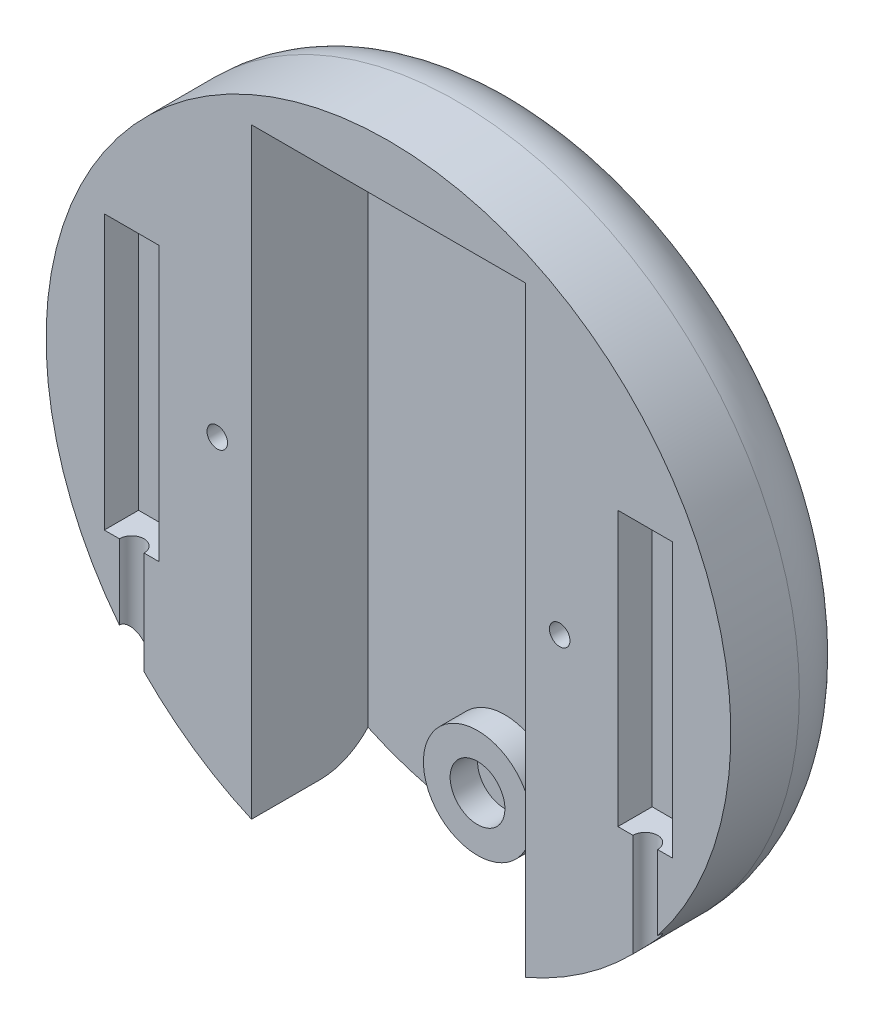
ISO-10303-21;
HEADER;
FILE_DESCRIPTION(('STEP AP214'),'2;1');
FILE_NAME('part.step','',(''),(''),'','','');
FILE_SCHEMA(('AUTOMOTIVE_DESIGN { 1 0 10303 214 1 1 1 1 }'));
ENDSEC;
DATA;
#1=APPLICATION_CONTEXT('core data for automotive mechanical design processes');
#2=APPLICATION_PROTOCOL_DEFINITION('international standard','automotive_design',2000,#1);
#3=PRODUCT_CONTEXT('',#1,'mechanical');
#4=PRODUCT('Part','Part','',(#3));
#5=PRODUCT_RELATED_PRODUCT_CATEGORY('part','',(#4));
#6=PRODUCT_DEFINITION_FORMATION('','',#4);
#7=PRODUCT_DEFINITION_CONTEXT('part definition',#1,'design');
#8=PRODUCT_DEFINITION('design','',#6,#7);
#9=PRODUCT_DEFINITION_SHAPE('','',#8);
#10=(LENGTH_UNIT() NAMED_UNIT(*) SI_UNIT(.MILLI.,.METRE.));
#11=(NAMED_UNIT(*) PLANE_ANGLE_UNIT() SI_UNIT($,.RADIAN.));
#12=(NAMED_UNIT(*) SI_UNIT($,.STERADIAN.) SOLID_ANGLE_UNIT());
#13=UNCERTAINTY_MEASURE_WITH_UNIT(LENGTH_MEASURE(1.E-05),#10,'distance_accuracy_value','');
#14=(GEOMETRIC_REPRESENTATION_CONTEXT(3) GLOBAL_UNCERTAINTY_ASSIGNED_CONTEXT((#13)) GLOBAL_UNIT_ASSIGNED_CONTEXT((#10,
#11,#12)) REPRESENTATION_CONTEXT('',''));
#15=CARTESIAN_POINT('',(0.,0.,0.));
#16=DIRECTION('',(0.,0.,1.));
#17=DIRECTION('',(1.,0.,0.));
#18=AXIS2_PLACEMENT_3D('',#15,#16,#17);
#19=CARTESIAN_POINT('',(0.,0.,20.));
#20=DIRECTION('',(0.,0.,1.));
#21=DIRECTION('',(1.,0.,0.));
#22=AXIS2_PLACEMENT_3D('',#19,#20,#21);
#23=PLANE('',#22);
#24=CARTESIAN_POINT('',(25.,0.,20.));
#25=DIRECTION('',(0.,0.,-1.));
#26=DIRECTION('',(-1.,0.,0.));
#27=AXIS2_PLACEMENT_3D('',#24,#25,#26);
#28=CIRCLE('',#27,1.5);
#29=CARTESIAN_POINT('',(23.5,0.,20.));
#30=VERTEX_POINT('',#29);
#31=EDGE_CURVE('E356',#30,#30,#28,.T.);
#32=ORIENTED_EDGE('',*,*,#31,.T.);
#33=EDGE_LOOP('',(#32));
#34=FACE_BOUND('',#33,.T.);
#35=CARTESIAN_POINT('',(-25.,0.,20.));
#36=DIRECTION('',(0.,0.,-1.));
#37=DIRECTION('',(-1.,0.,0.));
#38=AXIS2_PLACEMENT_3D('',#35,#36,#37);
#39=CIRCLE('',#38,1.5);
#40=CARTESIAN_POINT('',(-26.5,0.,20.));
#41=VERTEX_POINT('',#40);
#42=EDGE_CURVE('E359',#41,#41,#39,.T.);
#43=ORIENTED_EDGE('',*,*,#42,.T.);
#44=EDGE_LOOP('',(#43));
#45=FACE_BOUND('',#44,.T.);
#46=DIRECTION('',(-1.,0.,0.));
#47=VECTOR('',#46,1.);
#48=CARTESIAN_POINT('',(20.,42.,20.));
#49=LINE('',#48,#47);
#50=CARTESIAN_POINT('',(20.,42.,20.));
#51=VERTEX_POINT('',#50);
#52=CARTESIAN_POINT('',(-20.,42.,20.));
#53=VERTEX_POINT('',#52);
#54=EDGE_CURVE('E176',#51,#53,#49,.T.);
#55=ORIENTED_EDGE('',*,*,#54,.F.);
#56=DIRECTION('',(0.,1.,0.));
#57=VECTOR('',#56,1.);
#58=CARTESIAN_POINT('',(20.,0.,20.));
#59=LINE('',#58,#57);
#60=CARTESIAN_POINT('',(20.,-45.8257569495584,20.));
#61=VERTEX_POINT('',#60);
#62=EDGE_CURVE('E158',#61,#51,#59,.T.);
#63=ORIENTED_EDGE('',*,*,#62,.F.);
#64=CARTESIAN_POINT('',(0.,0.,20.));
#65=DIRECTION('',(0.,0.,1.));
#66=DIRECTION('',(1.,0.,0.));
#67=AXIS2_PLACEMENT_3D('',#64,#65,#66);
#68=CIRCLE('',#67,50.);
#69=CARTESIAN_POINT('',(35.7,-35.0072849561345,20.));
#70=VERTEX_POINT('',#69);
#71=EDGE_CURVE('E170',#61,#70,#68,.T.);
#72=ORIENTED_EDGE('',*,*,#71,.T.);
#73=DIRECTION('',(0.,1.,0.));
#74=VECTOR('',#73,1.);
#75=CARTESIAN_POINT('',(35.7,-39.,20.));
#76=LINE('',#75,#74);
#77=CARTESIAN_POINT('',(35.7,-20.,20.));
#78=VERTEX_POINT('',#77);
#79=EDGE_CURVE('E250',#78,#70,#76,.F.);
#80=ORIENTED_EDGE('',*,*,#79,.F.);
#81=DIRECTION('',(1.,0.,0.));
#82=VECTOR('',#81,1.);
#83=CARTESIAN_POINT('',(37.5,-20.,20.));
#84=LINE('',#83,#82);
#85=CARTESIAN_POINT('',(33.5,-20.,20.));
#86=VERTEX_POINT('',#85);
#87=EDGE_CURVE('E258',#86,#78,#84,.T.);
#88=ORIENTED_EDGE('',*,*,#87,.F.);
#89=DIRECTION('',(0.,-1.,0.));
#90=VECTOR('',#89,1.);
#91=CARTESIAN_POINT('',(33.5,-20.,20.));
#92=LINE('',#91,#90);
#93=CARTESIAN_POINT('',(33.5,20.,20.));
#94=VERTEX_POINT('',#93);
#95=EDGE_CURVE('E273',#94,#86,#92,.T.);
#96=ORIENTED_EDGE('',*,*,#95,.F.);
#97=DIRECTION('',(-1.,0.,0.));
#98=VECTOR('',#97,1.);
#99=CARTESIAN_POINT('',(33.5,20.,20.));
#100=LINE('',#99,#98);
#101=CARTESIAN_POINT('',(41.5,20.,20.));
#102=VERTEX_POINT('',#101);
#103=EDGE_CURVE('E270',#102,#94,#100,.T.);
#104=ORIENTED_EDGE('',*,*,#103,.F.);
#105=DIRECTION('',(0.,1.,0.));
#106=VECTOR('',#105,1.);
#107=CARTESIAN_POINT('',(41.5,20.,20.));
#108=LINE('',#107,#106);
#109=CARTESIAN_POINT('',(41.5,-20.,20.));
#110=VERTEX_POINT('',#109);
#111=EDGE_CURVE('E253',#110,#102,#108,.T.);
#112=ORIENTED_EDGE('',*,*,#111,.F.);
#113=CARTESIAN_POINT('',(39.3,-20.,20.));
#114=VERTEX_POINT('',#113);
#115=EDGE_CURVE('E276',#114,#110,#84,.T.);
#116=ORIENTED_EDGE('',*,*,#115,.F.);
#117=DIRECTION('',(0.,1.,0.));
#118=VECTOR('',#117,1.);
#119=CARTESIAN_POINT('',(39.3,-39.,20.));
#120=LINE('',#119,#118);
#121=CARTESIAN_POINT('',(39.3,-30.9113247855863,20.));
#122=VERTEX_POINT('',#121);
#123=EDGE_CURVE('E249',#122,#114,#120,.T.);
#124=ORIENTED_EDGE('',*,*,#123,.F.);
#125=CARTESIAN_POINT('',(-39.3,-30.9113247855863,20.));
#126=VERTEX_POINT('',#125);
#127=EDGE_CURVE('E305',#122,#126,#68,.T.);
#128=ORIENTED_EDGE('',*,*,#127,.T.);
#129=DIRECTION('',(0.,1.,0.));
#130=VECTOR('',#129,1.);
#131=CARTESIAN_POINT('',(-39.3,-39.,20.));
#132=LINE('',#131,#130);
#133=CARTESIAN_POINT('',(-39.3,-20.,20.));
#134=VERTEX_POINT('',#133);
#135=EDGE_CURVE('E201',#126,#134,#132,.T.);
#136=ORIENTED_EDGE('',*,*,#135,.T.);
#137=DIRECTION('',(-1.,0.,0.));
#138=VECTOR('',#137,1.);
#139=CARTESIAN_POINT('',(-37.5,-20.,20.));
#140=LINE('',#139,#138);
#141=CARTESIAN_POINT('',(-41.5,-20.,20.));
#142=VERTEX_POINT('',#141);
#143=EDGE_CURVE('E637',#134,#142,#140,.T.);
#144=ORIENTED_EDGE('',*,*,#143,.T.);
#145=DIRECTION('',(0.,1.,0.));
#146=VECTOR('',#145,1.);
#147=CARTESIAN_POINT('',(-41.5,20.,20.));
#148=LINE('',#147,#146);
#149=CARTESIAN_POINT('',(-41.5,20.,20.));
#150=VERTEX_POINT('',#149);
#151=EDGE_CURVE('E645',#142,#150,#148,.T.);
#152=ORIENTED_EDGE('',*,*,#151,.T.);
#153=DIRECTION('',(1.,0.,0.));
#154=VECTOR('',#153,1.);
#155=CARTESIAN_POINT('',(-33.5,20.,20.));
#156=LINE('',#155,#154);
#157=CARTESIAN_POINT('',(-33.5,20.,20.));
#158=VERTEX_POINT('',#157);
#159=EDGE_CURVE('E656',#150,#158,#156,.T.);
#160=ORIENTED_EDGE('',*,*,#159,.T.);
#161=DIRECTION('',(0.,-1.,0.));
#162=VECTOR('',#161,1.);
#163=CARTESIAN_POINT('',(-33.5,-20.,20.));
#164=LINE('',#163,#162);
#165=CARTESIAN_POINT('',(-33.5,-20.,20.));
#166=VERTEX_POINT('',#165);
#167=EDGE_CURVE('E653',#158,#166,#164,.T.);
#168=ORIENTED_EDGE('',*,*,#167,.T.);
#169=CARTESIAN_POINT('',(-35.7,-20.,20.));
#170=VERTEX_POINT('',#169);
#171=EDGE_CURVE('E638',#166,#170,#140,.T.);
#172=ORIENTED_EDGE('',*,*,#171,.T.);
#173=DIRECTION('',(0.,1.,0.));
#174=VECTOR('',#173,1.);
#175=CARTESIAN_POINT('',(-35.7,-39.,20.));
#176=LINE('',#175,#174);
#177=CARTESIAN_POINT('',(-35.7,-35.0072849561345,20.));
#178=VERTEX_POINT('',#177);
#179=EDGE_CURVE('E630',#170,#178,#176,.F.);
#180=ORIENTED_EDGE('',*,*,#179,.T.);
#181=CARTESIAN_POINT('',(-20.,-45.8257569495584,20.));
#182=VERTEX_POINT('',#181);
#183=EDGE_CURVE('E304',#178,#182,#68,.T.);
#184=ORIENTED_EDGE('',*,*,#183,.T.);
#185=DIRECTION('',(0.,-1.,0.));
#186=VECTOR('',#185,1.);
#187=CARTESIAN_POINT('',(-20.,-37.,20.));
#188=LINE('',#187,#186);
#189=EDGE_CURVE('E183',#53,#182,#188,.T.);
#190=ORIENTED_EDGE('',*,*,#189,.F.);
#191=EDGE_LOOP('',(#55,#63,#72,#80,#88,#96,#104,#112,#116,#124,#128,#136,#144,#152,#160,#168,
#172,#180,#184,#190));
#192=FACE_BOUND('',#191,.T.);
#193=ADVANCED_FACE('F38',(#34,#45,#192),#23,.T.);
#194=CARTESIAN_POINT('',(0.,0.,20.));
#195=DIRECTION('',(0.,0.,-1.));
#196=DIRECTION('',(-1.,0.,0.));
#197=AXIS2_PLACEMENT_3D('',#194,#195,#196);
#198=CYLINDRICAL_SURFACE('',#197,50.);
#199=DIRECTION('',(0.,0.,-1.));
#200=VECTOR('',#199,1.);
#201=CARTESIAN_POINT('',(20.,-45.8257569495584,20.));
#202=LINE('',#201,#200);
#203=CARTESIAN_POINT('',(20.,-45.8257569495584,10.));
#204=VERTEX_POINT('',#203);
#205=EDGE_CURVE('E164',#61,#204,#202,.T.);
#206=ORIENTED_EDGE('',*,*,#205,.T.);
#207=CARTESIAN_POINT('',(0.,0.,10.));
#208=DIRECTION('',(0.,0.,1.));
#209=DIRECTION('',(1.,0.,0.));
#210=AXIS2_PLACEMENT_3D('',#207,#208,#209);
#211=CIRCLE('',#210,50.);
#212=CARTESIAN_POINT('',(-20.,-45.8257569495584,10.));
#213=VERTEX_POINT('',#212);
#214=EDGE_CURVE('E309',#204,#213,#211,.T.);
#215=ORIENTED_EDGE('',*,*,#214,.T.);
#216=DIRECTION('',(0.,0.,-1.));
#217=VECTOR('',#216,1.);
#218=CARTESIAN_POINT('',(-20.,-45.8257569495584,20.));
#219=LINE('',#218,#217);
#220=EDGE_CURVE('E302',#213,#182,#219,.F.);
#221=ORIENTED_EDGE('',*,*,#220,.T.);
#222=ORIENTED_EDGE('',*,*,#183,.F.);
#223=CARTESIAN_POINT('',(-39.3,-30.9113247855863,20.));
#224=CARTESIAN_POINT('',(-39.3000113905489,-30.9113095866272,19.9622195490381));
#225=CARTESIAN_POINT('',(-39.2988109686129,-30.9128364828785,19.9244502922509));
#226=CARTESIAN_POINT('',(-39.2940750450098,-30.9188565884171,19.8493415683228));
#227=CARTESIAN_POINT('',(-39.2905424072055,-30.9233461596617,19.812001631138));
#228=CARTESIAN_POINT('',(-39.2812841900234,-30.9351056902559,19.7384932189197));
#229=CARTESIAN_POINT('',(-39.2755845129836,-30.9423428071075,19.7023161808821));
#230=CARTESIAN_POINT('',(-39.2621396192767,-30.9594010143059,19.6309695137161));
#231=CARTESIAN_POINT('',(-39.2543939092287,-30.9692227279012,19.5958001298444));
#232=CARTESIAN_POINT('',(-39.2284238152187,-31.0021215576488,19.4924914447561));
#233=CARTESIAN_POINT('',(-39.2074106803524,-31.0287034616242,19.4261328344424));
#234=CARTESIAN_POINT('',(-39.1593537208443,-31.0893312570266,19.2991524380024));
#235=CARTESIAN_POINT('',(-39.1322905355879,-31.1234011043944,19.2385499794939));
#236=CARTESIAN_POINT('',(-39.0574790359773,-31.2172803014744,19.0921374162224));
#237=CARTESIAN_POINT('',(-39.0064797785406,-31.2810187629545,19.010515263377));
#238=CARTESIAN_POINT('',(-38.8968318864573,-31.4172589788756,18.860921487851));
#239=CARTESIAN_POINT('',(-38.8381669142414,-31.4897794250416,18.7929798307715));
#240=CARTESIAN_POINT('',(-38.7297044406301,-31.6230229989727,18.6838374816607));
#241=CARTESIAN_POINT('',(-38.681000515062,-31.6825878059134,18.6400880240143));
#242=CARTESIAN_POINT('',(-38.5810851733456,-31.8041833759496,18.559381965557));
#243=CARTESIAN_POINT('',(-38.5298724843205,-31.8662153877706,18.5224288591911));
#244=CARTESIAN_POINT('',(-38.37313444235,-32.0550963384246,18.4210251205572));
#245=CARTESIAN_POINT('',(-38.2645766948329,-32.1846469745237,18.366095231075));
#246=CARTESIAN_POINT('',(-38.0816753712339,-32.400593895807,18.2948348384914));
#247=CARTESIAN_POINT('',(-38.0087551286184,-32.4861104761591,18.2717234192246));
#248=CARTESIAN_POINT('',(-37.8612832397242,-32.6578629823732,18.234992561564));
#249=CARTESIAN_POINT('',(-37.7867310605112,-32.7440991373581,18.2213762731268));
#250=CARTESIAN_POINT('',(-37.636551250593,-32.9166081800698,18.2035947620835));
#251=CARTESIAN_POINT('',(-37.5609235816099,-33.0028810689975,18.1994298767148));
#252=CARTESIAN_POINT('',(-37.4091416200439,-33.1748291033227,18.2006945823671));
#253=CARTESIAN_POINT('',(-37.3329874905211,-33.2605044186228,18.2061213244978));
#254=CARTESIAN_POINT('',(-37.1333224690868,-33.4835862267327,18.2333343660083));
#255=CARTESIAN_POINT('',(-37.0097716060247,-33.6200773760434,18.2631872624645));
#256=CARTESIAN_POINT('',(-36.7659588903201,-33.8865266740645,18.3513786049946));
#257=CARTESIAN_POINT('',(-36.6456908199295,-34.0164976300133,18.4096585867868));
#258=CARTESIAN_POINT('',(-36.4509042383544,-34.2249172141612,18.5343570864593));
#259=CARTESIAN_POINT('',(-36.3741424493222,-34.3064616418183,18.5920861051918));
#260=CARTESIAN_POINT('',(-36.2268849919649,-34.4619236429686,18.7237136956388));
#261=CARTESIAN_POINT('',(-36.1563813271921,-34.5358509693839,18.7975912025848));
#262=CARTESIAN_POINT('',(-36.0411724304362,-34.6560107670033,18.9425533426129));
#263=CARTESIAN_POINT('',(-35.9943550964397,-34.7046138323566,19.0099788208368));
#264=CARTESIAN_POINT('',(-35.9085842550153,-34.7933524160379,19.1547513345899));
#265=CARTESIAN_POINT('',(-35.8696213318991,-34.8334980755442,19.2320863066468));
#266=CARTESIAN_POINT('',(-35.8084103943643,-34.8964082911829,19.3805442259671));
#267=CARTESIAN_POINT('',(-35.7844022380594,-34.9210158952763,19.4501558929035));
#268=CARTESIAN_POINT('',(-35.7447860616849,-34.961565776705,19.5940898236361));
#269=CARTESIAN_POINT('',(-35.7291611784404,-34.9775254502282,19.6684022922743));
#270=CARTESIAN_POINT('',(-35.712243971232,-34.9947953713046,19.7861244488754));
#271=CARTESIAN_POINT('',(-35.707668284621,-34.9994636682536,19.8286103946822));
#272=CARTESIAN_POINT('',(-35.7015408880683,-35.0057136085978,19.9140547173503));
#273=CARTESIAN_POINT('',(-35.6999913605228,-35.0072930243642,19.9570134127119));
#274=CARTESIAN_POINT('',(-35.7,-35.0072849561345,20.));
#275=B_SPLINE_CURVE_WITH_KNOTS('',3,(#223,#224,#225,#226,#227,#228,#229,#230,#231,#232,#233,
#234,#235,#236,#237,#238,#239,#240,#241,#242,#243,#244,#245,#246,#247,#248,#249,#250,#251,#252,
#253,#254,#255,#256,#257,#258,#259,#260,#261,#262,#263,#264,#265,#266,#267,#268,#269,#270,#271,
#272,#273,#274),.UNSPECIFIED.,.F.,.F.,(4,2,2,2,2,2,2,2,2,2,2,2,2,2,2,2,2,2,2,2,2,2,2,2,2,4),(0.,
0.113273412135658,0.226407987380685,0.33823075538149,0.450080513014545,0.672513072677607,
0.895667889985003,1.24003494343963,1.58514827997874,1.85032248284452,2.11563265011204,
2.64662509043665,2.99050733111554,3.33450359860793,3.67851214011161,4.02241852190564,
4.57989385163577,5.13622745895358,5.51310286110088,5.88948955409561,6.17469403374631,
6.4595545565671,6.69154184485919,6.92306071824576,7.05181878230794,7.18066966947345),.UNSPECIFIED.);
#276=EDGE_CURVE('E194',#126,#178,#275,.T.);
#277=ORIENTED_EDGE('',*,*,#276,.F.);
#278=ORIENTED_EDGE('',*,*,#127,.F.);
#279=CARTESIAN_POINT('',(39.3,-30.9113247855863,20.));
#280=CARTESIAN_POINT('',(39.3000113905489,-30.9113095866272,19.962219549038));
#281=CARTESIAN_POINT('',(39.2988109686129,-30.9128364828785,19.9244502922509));
#282=CARTESIAN_POINT('',(39.2940750450098,-30.9188565884171,19.8493415683228));
#283=CARTESIAN_POINT('',(39.2905424072055,-30.9233461596617,19.812001631138));
#284=CARTESIAN_POINT('',(39.2812841900234,-30.935105690256,19.7384932189197));
#285=CARTESIAN_POINT('',(39.2755845129836,-30.9423428071075,19.7023161808821));
#286=CARTESIAN_POINT('',(39.2621396192767,-30.9594010143059,19.6309695137161));
#287=CARTESIAN_POINT('',(39.2543939092287,-30.9692227279012,19.5958001298444));
#288=CARTESIAN_POINT('',(39.2284238152187,-31.0021215576488,19.4924914447561));
#289=CARTESIAN_POINT('',(39.2074106803524,-31.0287034616243,19.4261328344424));
#290=CARTESIAN_POINT('',(39.1593537208444,-31.0893312570266,19.2991524380024));
#291=CARTESIAN_POINT('',(39.1322905355879,-31.1234011043944,19.2385499794939));
#292=CARTESIAN_POINT('',(39.0574790359773,-31.2172803014744,19.0921374162224));
#293=CARTESIAN_POINT('',(39.0064797785405,-31.2810187629545,19.010515263377));
#294=CARTESIAN_POINT('',(38.8968318864573,-31.4172589788756,18.860921487851));
#295=CARTESIAN_POINT('',(38.8381669142414,-31.4897794250416,18.7929798307715));
#296=CARTESIAN_POINT('',(38.7297044406301,-31.6230229989727,18.6838374816607));
#297=CARTESIAN_POINT('',(38.681000515062,-31.6825878059134,18.6400880240143));
#298=CARTESIAN_POINT('',(38.5810851733457,-31.8041833759496,18.559381965557));
#299=CARTESIAN_POINT('',(38.5298724843205,-31.8662153877706,18.5224288591911));
#300=CARTESIAN_POINT('',(38.37313444235,-32.0550963384246,18.4210251205572));
#301=CARTESIAN_POINT('',(38.2645766948329,-32.1846469745237,18.366095231075));
#302=CARTESIAN_POINT('',(38.0816753712339,-32.400593895807,18.2948348384914));
#303=CARTESIAN_POINT('',(38.0087551286184,-32.4861104761591,18.2717234192246));
#304=CARTESIAN_POINT('',(37.8612832397242,-32.6578629823732,18.234992561564));
#305=CARTESIAN_POINT('',(37.7867310605112,-32.7440991373581,18.2213762731268));
#306=CARTESIAN_POINT('',(37.636551250593,-32.9166081800698,18.2035947620835));
#307=CARTESIAN_POINT('',(37.5609235816099,-33.0028810689975,18.1994298767148));
#308=CARTESIAN_POINT('',(37.4091416200439,-33.1748291033227,18.2006945823671));
#309=CARTESIAN_POINT('',(37.3329874905211,-33.2605044186228,18.2061213244978));
#310=CARTESIAN_POINT('',(37.1333224690868,-33.4835862267327,18.2333343660083));
#311=CARTESIAN_POINT('',(37.0097716060247,-33.6200773760434,18.2631872624645));
#312=CARTESIAN_POINT('',(36.7659588903201,-33.8865266740645,18.3513786049946));
#313=CARTESIAN_POINT('',(36.6456908199295,-34.0164976300133,18.4096585867868));
#314=CARTESIAN_POINT('',(36.4509042383544,-34.2249172141612,18.5343570864593));
#315=CARTESIAN_POINT('',(36.3741424493222,-34.3064616418183,18.5920861051918));
#316=CARTESIAN_POINT('',(36.2268849919649,-34.4619236429686,18.7237136956388));
#317=CARTESIAN_POINT('',(36.1563813271921,-34.5358509693839,18.7975912025848));
#318=CARTESIAN_POINT('',(36.0411724304362,-34.6560107670033,18.9425533426129));
#319=CARTESIAN_POINT('',(35.9943550964397,-34.7046138323566,19.0099788208368));
#320=CARTESIAN_POINT('',(35.9085842550153,-34.7933524160379,19.1547513345899));
#321=CARTESIAN_POINT('',(35.8696213318991,-34.8334980755442,19.2320863066468));
#322=CARTESIAN_POINT('',(35.8084103943643,-34.8964082911829,19.3805442259671));
#323=CARTESIAN_POINT('',(35.7844022380594,-34.9210158952763,19.4501558929035));
#324=CARTESIAN_POINT('',(35.7447860616849,-34.961565776705,19.5940898236361));
#325=CARTESIAN_POINT('',(35.7291611784404,-34.9775254502282,19.6684022922743));
#326=CARTESIAN_POINT('',(35.712243971232,-34.9947953713046,19.7861244488754));
#327=CARTESIAN_POINT('',(35.707668284621,-34.9994636682536,19.8286103946822));
#328=CARTESIAN_POINT('',(35.7015408880683,-35.0057136085978,19.9140547173503));
#329=CARTESIAN_POINT('',(35.6999913605228,-35.0072930243642,19.9570134127119));
#330=CARTESIAN_POINT('',(35.7,-35.0072849561345,20.));
#331=B_SPLINE_CURVE_WITH_KNOTS('',3,(#279,#280,#281,#282,#283,#284,#285,#286,#287,#288,#289,
#290,#291,#292,#293,#294,#295,#296,#297,#298,#299,#300,#301,#302,#303,#304,#305,#306,#307,#308,
#309,#310,#311,#312,#313,#314,#315,#316,#317,#318,#319,#320,#321,#322,#323,#324,#325,#326,#327,
#328,#329,#330),.UNSPECIFIED.,.F.,.F.,(4,2,2,2,2,2,2,2,2,2,2,2,2,2,2,2,2,2,2,2,2,2,2,2,2,4),(0.,
0.113273412135658,0.226407987380683,0.338230755381491,0.450080513014547,0.672513072677613,
0.895667889984996,1.24003494343963,1.58514827997873,1.85032248284451,2.11563265011203,
2.64662509043663,2.99050733111553,3.33450359860792,3.6785121401116,4.02241852190562,
4.57989385163577,5.13622745895358,5.51310286110088,5.88948955409561,6.17469403374631,
6.4595545565671,6.69154184485918,6.92306071824576,7.05181878230793,7.18066966947344),.UNSPECIFIED.);
#332=EDGE_CURVE('E241',#122,#70,#331,.T.);
#333=ORIENTED_EDGE('',*,*,#332,.T.);
#334=ORIENTED_EDGE('',*,*,#71,.F.);
#335=EDGE_LOOP('',(#206,#215,#221,#222,#277,#278,#333,#334));
#336=FACE_BOUND('',#335,.T.);
#337=ADVANCED_FACE('F203',(#336),#198,.T.);
#338=CARTESIAN_POINT('',(0.,0.,0.));
#339=DIRECTION('',(0.,0.,1.));
#340=DIRECTION('',(1.,0.,0.));
#341=AXIS2_PLACEMENT_3D('',#338,#339,#340);
#342=PLANE('',#341);
#343=CARTESIAN_POINT('',(-25.,0.,0.));
#344=DIRECTION('',(0.,0.,-1.));
#345=DIRECTION('',(-1.,0.,0.));
#346=AXIS2_PLACEMENT_3D('',#343,#344,#345);
#347=CIRCLE('',#346,2.5);
#348=CARTESIAN_POINT('',(-27.5,0.,0.));
#349=VERTEX_POINT('',#348);
#350=EDGE_CURVE('E372',#349,#349,#347,.T.);
#351=ORIENTED_EDGE('',*,*,#350,.F.);
#352=EDGE_LOOP('',(#351));
#353=FACE_BOUND('',#352,.T.);
#354=CARTESIAN_POINT('',(25.,0.,0.));
#355=DIRECTION('',(0.,0.,-1.));
#356=DIRECTION('',(-1.,0.,0.));
#357=AXIS2_PLACEMENT_3D('',#354,#355,#356);
#358=CIRCLE('',#357,2.5);
#359=CARTESIAN_POINT('',(22.5,0.,0.));
#360=VERTEX_POINT('',#359);
#361=EDGE_CURVE('E377',#360,#360,#358,.T.);
#362=ORIENTED_EDGE('',*,*,#361,.F.);
#363=EDGE_LOOP('',(#362));
#364=FACE_BOUND('',#363,.T.);
#365=CARTESIAN_POINT('',(0.,0.,0.));
#366=DIRECTION('',(0.,0.,1.));
#367=DIRECTION('',(1.,0.,0.));
#368=AXIS2_PLACEMENT_3D('',#365,#366,#367);
#369=CIRCLE('',#368,40.);
#370=CARTESIAN_POINT('',(40.,0.,0.));
#371=VERTEX_POINT('',#370);
#372=EDGE_CURVE('E11',#371,#371,#369,.F.);
#373=ORIENTED_EDGE('',*,*,#372,.T.);
#374=EDGE_LOOP('',(#373));
#375=FACE_BOUND('',#374,.T.);
#376=ADVANCED_FACE('F352',(#353,#364,#375),#342,.F.);
#377=CARTESIAN_POINT('',(0.,0.,3.));
#378=DIRECTION('',(0.,0.,1.));
#379=DIRECTION('',(1.,0.,0.));
#380=AXIS2_PLACEMENT_3D('',#377,#378,#379);
#381=PLANE('',#380);
#382=CARTESIAN_POINT('',(0.,-39.,3.));
#383=DIRECTION('',(0.,0.,1.));
#384=DIRECTION('',(1.,0.,0.));
#385=AXIS2_PLACEMENT_3D('',#382,#383,#384);
#386=CIRCLE('',#385,7.9);
#387=CARTESIAN_POINT('',(7.9,-39.,3.));
#388=VERTEX_POINT('',#387);
#389=EDGE_CURVE('E290',#388,#388,#386,.T.);
#390=ORIENTED_EDGE('',*,*,#389,.F.);
#391=EDGE_LOOP('',(#390));
#392=FACE_BOUND('',#391,.T.);
#393=DIRECTION('',(0.,-1.,0.));
#394=VECTOR('',#393,1.);
#395=CARTESIAN_POINT('',(-20.,-37.,3.));
#396=LINE('',#395,#394);
#397=CARTESIAN_POINT('',(-20.,42.,3.));
#398=VERTEX_POINT('',#397);
#399=CARTESIAN_POINT('',(-20.,-42.6885731113541,3.));
#400=VERTEX_POINT('',#399);
#401=EDGE_CURVE('E296',#398,#400,#396,.T.);
#402=ORIENTED_EDGE('',*,*,#401,.T.);
#403=CARTESIAN_POINT('',(0.,0.,3.));
#404=DIRECTION('',(0.,0.,1.));
#405=DIRECTION('',(1.,0.,0.));
#406=AXIS2_PLACEMENT_3D('',#403,#404,#405);
#407=CIRCLE('',#406,47.1414284285429);
#408=CARTESIAN_POINT('',(20.,-42.6885731113541,3.));
#409=VERTEX_POINT('',#408);
#410=EDGE_CURVE('E54',#400,#409,#407,.T.);
#411=ORIENTED_EDGE('',*,*,#410,.T.);
#412=DIRECTION('',(0.,1.,0.));
#413=VECTOR('',#412,1.);
#414=CARTESIAN_POINT('',(20.,40.,3.));
#415=LINE('',#414,#413);
#416=CARTESIAN_POINT('',(20.,42.,3.));
#417=VERTEX_POINT('',#416);
#418=EDGE_CURVE('E298',#409,#417,#415,.T.);
#419=ORIENTED_EDGE('',*,*,#418,.T.);
#420=DIRECTION('',(1.,0.,0.));
#421=VECTOR('',#420,1.);
#422=CARTESIAN_POINT('',(20.,42.,3.));
#423=LINE('',#422,#421);
#424=EDGE_CURVE('E178',#398,#417,#423,.T.);
#425=ORIENTED_EDGE('',*,*,#424,.F.);
#426=EDGE_LOOP('',(#402,#411,#419,#425));
#427=FACE_BOUND('',#426,.T.);
#428=ADVANCED_FACE('F323',(#392,#427),#381,.T.);
#429=CARTESIAN_POINT('',(-20.,-37.,3.));
#430=DIRECTION('',(-1.,0.,0.));
#431=DIRECTION('',(0.,-1.,0.));
#432=AXIS2_PLACEMENT_3D('',#429,#430,#431);
#433=PLANE('',#432);
#434=ORIENTED_EDGE('',*,*,#220,.F.);
#435=CARTESIAN_POINT('',(-20.,-45.8257569495584,10.));
#436=CARTESIAN_POINT('',(-20.,-45.8257981918486,9.73674798918007));
#437=CARTESIAN_POINT('',(-20.,-45.8144166724769,9.47350706290155));
#438=CARTESIAN_POINT('',(-20.,-45.7691095360346,8.94901403467225));
#439=CARTESIAN_POINT('',(-20.,-45.7351876106402,8.68776161412903));
#440=CARTESIAN_POINT('',(-20.,-45.6452120610025,8.1697647135663));
#441=CARTESIAN_POINT('',(-20.,-45.5892132586178,7.9130107000805));
#442=CARTESIAN_POINT('',(-20.,-45.4556556219263,7.40518140172065));
#443=CARTESIAN_POINT('',(-20.,-45.3780970279812,7.15410605357112));
#444=CARTESIAN_POINT('',(-20.,-45.202176820951,6.65936854689085));
#445=CARTESIAN_POINT('',(-20.,-45.1038158698911,6.41570615272854));
#446=CARTESIAN_POINT('',(-20.,-44.8872199455018,5.93737849218722));
#447=CARTESIAN_POINT('',(-20.,-44.7689842160141,5.70271356854444));
#448=CARTESIAN_POINT('',(-20.,-44.513748304308,5.2438903708141));
#449=CARTESIAN_POINT('',(-20.,-44.3767517223183,5.01973009192439));
#450=CARTESIAN_POINT('',(-20.,-44.085224344072,4.58322445339545));
#451=CARTESIAN_POINT('',(-20.,-43.9306987466765,4.37087561834849));
#452=CARTESIAN_POINT('',(-20.,-43.6035989753585,3.95681155591755));
#453=CARTESIAN_POINT('',(-20.,-43.4308466194334,3.75523726831171));
#454=CARTESIAN_POINT('',(-20.,-43.0705231564546,3.36663150977497));
#455=CARTESIAN_POINT('',(-20.,-42.8829860535906,3.17956852388272));
#456=CARTESIAN_POINT('',(-20.,-42.6885731113541,3.));
#457=B_SPLINE_CURVE_WITH_KNOTS('',3,(#435,#436,#437,#438,#439,#440,#441,#442,#443,#444,#445,
#446,#447,#448,#449,#450,#451,#452,#453,#454,#455,#456),.UNSPECIFIED.,.F.,.F.,(4,2,2,2,2,2,2,2,
2,2,4),(0.,0.789493192768886,1.57885711390613,2.36627308996522,3.15368028778404,
3.94106243050993,4.72847453685952,5.51573574913885,6.30276407822293,7.09836092246447,
7.89217851859986),.UNSPECIFIED.);
#458=EDGE_CURVE('E62',#213,#400,#457,.T.);
#459=ORIENTED_EDGE('',*,*,#458,.T.);
#460=ORIENTED_EDGE('',*,*,#401,.F.);
#461=DIRECTION('',(0.,0.,-1.));
#462=VECTOR('',#461,1.);
#463=CARTESIAN_POINT('',(-20.,42.,3.));
#464=LINE('',#463,#462);
#465=EDGE_CURVE('E185',#53,#398,#464,.T.);
#466=ORIENTED_EDGE('',*,*,#465,.F.);
#467=ORIENTED_EDGE('',*,*,#189,.T.);
#468=EDGE_LOOP('',(#434,#459,#460,#466,#467));
#469=FACE_BOUND('',#468,.T.);
#470=ADVANCED_FACE('F318',(#469),#433,.F.);
#471=CARTESIAN_POINT('',(20.,40.,3.));
#472=DIRECTION('',(1.,0.,0.));
#473=DIRECTION('',(0.,1.,0.));
#474=AXIS2_PLACEMENT_3D('',#471,#472,#473);
#475=PLANE('',#474);
#476=ORIENTED_EDGE('',*,*,#418,.F.);
#477=CARTESIAN_POINT('',(20.,-42.6885731113541,3.));
#478=CARTESIAN_POINT('',(20.,-42.889852232235,3.18590647423864));
#479=CARTESIAN_POINT('',(20.,-43.0837590550175,3.37984905415732));
#480=CARTESIAN_POINT('',(20.,-43.4553425737054,3.78282509783425));
#481=CARTESIAN_POINT('',(20.,-43.6330134593437,3.99186391646284));
#482=CARTESIAN_POINT('',(20.,-43.9709444527254,4.42449393629911));
#483=CARTESIAN_POINT('',(20.,-44.131156800524,4.6481225069595));
#484=CARTESIAN_POINT('',(20.,-44.4321255676855,5.10807299938418));
#485=CARTESIAN_POINT('',(20.,-44.5728849082407,5.344393007901));
#486=CARTESIAN_POINT('',(20.,-44.833971992489,5.82891683617795));
#487=CARTESIAN_POINT('',(20.,-44.9542423249619,6.07715162900768));
#488=CARTESIAN_POINT('',(20.,-45.1726493177845,6.5831720658399));
#489=CARTESIAN_POINT('',(20.,-45.2707869969441,6.84095726958178));
#490=CARTESIAN_POINT('',(20.,-45.4436804059481,7.36352716226794));
#491=CARTESIAN_POINT('',(20.,-45.5184950443105,7.62829235436554));
#492=CARTESIAN_POINT('',(20.,-45.6442454237399,8.16331754604419));
#493=CARTESIAN_POINT('',(20.,-45.6951930678372,8.43357473631626));
#494=CARTESIAN_POINT('',(20.,-45.7644897262316,8.91993003541697));
#495=CARTESIAN_POINT('',(20.,-45.7874565328958,9.13538165853447));
#496=CARTESIAN_POINT('',(20.,-45.8180925603834,9.56721504192403));
#497=CARTESIAN_POINT('',(20.,-45.8257726538308,9.78359603133346));
#498=CARTESIAN_POINT('',(20.,-45.8257569495584,10.));
#499=B_SPLINE_CURVE_WITH_KNOTS('',3,(#477,#478,#479,#480,#481,#482,#483,#484,#485,#486,#487,
#488,#489,#490,#491,#492,#493,#494,#495,#496,#497,#498),.UNSPECIFIED.,.F.,.F.,(4,2,2,2,2,2,2,2,
2,2,4),(0.,0.821831899538207,1.64395676119951,2.4682769904361,3.29247329947096,4.11894236033733,
4.94537336942432,5.76969977176619,6.59361462435931,7.24310839124007,7.89214004253148),.UNSPECIFIED.);
#500=EDGE_CURVE('E47',#409,#204,#499,.T.);
#501=ORIENTED_EDGE('',*,*,#500,.T.);
#502=ORIENTED_EDGE('',*,*,#205,.F.);
#503=ORIENTED_EDGE('',*,*,#62,.T.);
#504=DIRECTION('',(0.,0.,1.));
#505=VECTOR('',#504,1.);
#506=CARTESIAN_POINT('',(20.,42.,3.));
#507=LINE('',#506,#505);
#508=EDGE_CURVE('E161',#417,#51,#507,.T.);
#509=ORIENTED_EDGE('',*,*,#508,.F.);
#510=EDGE_LOOP('',(#476,#501,#502,#503,#509));
#511=FACE_BOUND('',#510,.T.);
#512=ADVANCED_FACE('F160',(#511),#475,.F.);
#513=CARTESIAN_POINT('',(0.,-39.,7.));
#514=DIRECTION('',(0.,0.,1.));
#515=DIRECTION('',(1.,0.,0.));
#516=AXIS2_PLACEMENT_3D('',#513,#514,#515);
#517=PLANE('',#516);
#518=CARTESIAN_POINT('',(0.,-39.,7.));
#519=DIRECTION('',(0.,0.,1.));
#520=DIRECTION('',(1.,0.,0.));
#521=AXIS2_PLACEMENT_3D('',#518,#519,#520);
#522=CIRCLE('',#521,7.9);
#523=CARTESIAN_POINT('',(7.9,-39.,7.));
#524=VERTEX_POINT('',#523);
#525=EDGE_CURVE('E291',#524,#524,#522,.T.);
#526=ORIENTED_EDGE('',*,*,#525,.T.);
#527=EDGE_LOOP('',(#526));
#528=FACE_BOUND('',#527,.T.);
#529=CARTESIAN_POINT('',(0.,-39.,7.));
#530=DIRECTION('',(0.,0.,1.));
#531=DIRECTION('',(1.,0.,0.));
#532=AXIS2_PLACEMENT_3D('',#529,#530,#531);
#533=CIRCLE('',#532,4.);
#534=CARTESIAN_POINT('',(4.,-39.,7.));
#535=VERTEX_POINT('',#534);
#536=EDGE_CURVE('E281',#535,#535,#533,.T.);
#537=ORIENTED_EDGE('',*,*,#536,.F.);
#538=EDGE_LOOP('',(#537));
#539=FACE_BOUND('',#538,.T.);
#540=ADVANCED_FACE('F328',(#528,#539),#517,.T.);
#541=CARTESIAN_POINT('',(0.,-39.,7.));
#542=DIRECTION('',(0.,0.,-1.));
#543=DIRECTION('',(-1.,0.,0.));
#544=AXIS2_PLACEMENT_3D('',#541,#542,#543);
#545=CYLINDRICAL_SURFACE('',#544,7.9);
#546=ORIENTED_EDGE('',*,*,#525,.F.);
#547=EDGE_LOOP('',(#546));
#548=FACE_BOUND('',#547,.T.);
#549=ORIENTED_EDGE('',*,*,#389,.T.);
#550=EDGE_LOOP('',(#549));
#551=FACE_BOUND('',#550,.T.);
#552=ADVANCED_FACE('F599',(#548,#551),#545,.T.);
#553=CARTESIAN_POINT('',(0.,-39.,7.));
#554=DIRECTION('',(0.,0.,-1.));
#555=DIRECTION('',(-1.,0.,0.));
#556=AXIS2_PLACEMENT_3D('',#553,#554,#555);
#557=CYLINDRICAL_SURFACE('',#556,4.);
#558=ORIENTED_EDGE('',*,*,#536,.T.);
#559=EDGE_LOOP('',(#558));
#560=FACE_BOUND('',#559,.T.);
#561=CARTESIAN_POINT('',(0.,-39.,3.));
#562=DIRECTION('',(0.,0.,1.));
#563=DIRECTION('',(1.,0.,0.));
#564=AXIS2_PLACEMENT_3D('',#561,#562,#563);
#565=CIRCLE('',#564,4.);
#566=CARTESIAN_POINT('',(4.,-39.,3.));
#567=VERTEX_POINT('',#566);
#568=EDGE_CURVE('E169',#567,#567,#565,.F.);
#569=ORIENTED_EDGE('',*,*,#568,.T.);
#570=EDGE_LOOP('',(#569));
#571=FACE_BOUND('',#570,.T.);
#572=ADVANCED_FACE('F589',(#560,#571),#557,.F.);
#573=ORIENTED_EDGE('',*,*,#568,.F.);
#574=EDGE_LOOP('',(#573));
#575=FACE_BOUND('',#574,.T.);
#576=ADVANCED_FACE('F389',(#575),#381,.T.);
#577=CARTESIAN_POINT('',(37.5,-20.,15.));
#578=DIRECTION('',(0.,-1.,0.));
#579=DIRECTION('',(0.,0.,-1.));
#580=AXIS2_PLACEMENT_3D('',#577,#578,#579);
#581=PLANE('',#580);
#582=ORIENTED_EDGE('',*,*,#87,.T.);
#583=CARTESIAN_POINT('',(37.5,-20.,20.));
#584=DIRECTION('',(0.,1.,0.));
#585=DIRECTION('',(0.,0.,1.));
#586=AXIS2_PLACEMENT_3D('',#583,#584,#585);
#587=CIRCLE('',#586,1.8);
#588=EDGE_CURVE('E664',#114,#78,#587,.T.);
#589=ORIENTED_EDGE('',*,*,#588,.F.);
#590=ORIENTED_EDGE('',*,*,#115,.T.);
#591=DIRECTION('',(0.,0.,1.));
#592=VECTOR('',#591,1.);
#593=CARTESIAN_POINT('',(41.5,-20.,15.));
#594=LINE('',#593,#592);
#595=CARTESIAN_POINT('',(41.5,-20.,15.));
#596=VERTEX_POINT('',#595);
#597=EDGE_CURVE('E267',#596,#110,#594,.T.);
#598=ORIENTED_EDGE('',*,*,#597,.F.);
#599=DIRECTION('',(1.,0.,0.));
#600=VECTOR('',#599,1.);
#601=CARTESIAN_POINT('',(41.5,-20.,15.));
#602=LINE('',#601,#600);
#603=CARTESIAN_POINT('',(33.5,-20.,15.));
#604=VERTEX_POINT('',#603);
#605=EDGE_CURVE('E254',#604,#596,#602,.T.);
#606=ORIENTED_EDGE('',*,*,#605,.F.);
#607=DIRECTION('',(0.,0.,1.));
#608=VECTOR('',#607,1.);
#609=CARTESIAN_POINT('',(33.5,-20.,15.));
#610=LINE('',#609,#608);
#611=EDGE_CURVE('E279',#604,#86,#610,.T.);
#612=ORIENTED_EDGE('',*,*,#611,.T.);
#613=EDGE_LOOP('',(#582,#589,#590,#598,#606,#612));
#614=FACE_BOUND('',#613,.T.);
#615=ADVANCED_FACE('F539',(#614),#581,.F.);
#616=CARTESIAN_POINT('',(33.5,-20.,15.));
#617=DIRECTION('',(-1.,0.,0.));
#618=DIRECTION('',(0.,0.,1.));
#619=AXIS2_PLACEMENT_3D('',#616,#617,#618);
#620=PLANE('',#619);
#621=ORIENTED_EDGE('',*,*,#95,.T.);
#622=ORIENTED_EDGE('',*,*,#611,.F.);
#623=DIRECTION('',(0.,-1.,0.));
#624=VECTOR('',#623,1.);
#625=CARTESIAN_POINT('',(33.5,-20.,15.));
#626=LINE('',#625,#624);
#627=CARTESIAN_POINT('',(33.5,20.,15.));
#628=VERTEX_POINT('',#627);
#629=EDGE_CURVE('E264',#628,#604,#626,.T.);
#630=ORIENTED_EDGE('',*,*,#629,.F.);
#631=DIRECTION('',(0.,0.,1.));
#632=VECTOR('',#631,1.);
#633=CARTESIAN_POINT('',(33.5,20.,15.));
#634=LINE('',#633,#632);
#635=EDGE_CURVE('E282',#628,#94,#634,.T.);
#636=ORIENTED_EDGE('',*,*,#635,.T.);
#637=EDGE_LOOP('',(#621,#622,#630,#636));
#638=FACE_BOUND('',#637,.T.);
#639=ADVANCED_FACE('F544',(#638),#620,.F.);
#640=CARTESIAN_POINT('',(33.5,20.,15.));
#641=DIRECTION('',(0.,1.,0.));
#642=DIRECTION('',(0.,0.,1.));
#643=AXIS2_PLACEMENT_3D('',#640,#641,#642);
#644=PLANE('',#643);
#645=ORIENTED_EDGE('',*,*,#103,.T.);
#646=ORIENTED_EDGE('',*,*,#635,.F.);
#647=DIRECTION('',(-1.,0.,0.));
#648=VECTOR('',#647,1.);
#649=CARTESIAN_POINT('',(33.5,20.,15.));
#650=LINE('',#649,#648);
#651=CARTESIAN_POINT('',(41.5,20.,15.));
#652=VERTEX_POINT('',#651);
#653=EDGE_CURVE('E261',#652,#628,#650,.T.);
#654=ORIENTED_EDGE('',*,*,#653,.F.);
#655=DIRECTION('',(0.,0.,1.));
#656=VECTOR('',#655,1.);
#657=CARTESIAN_POINT('',(41.5,20.,15.));
#658=LINE('',#657,#656);
#659=EDGE_CURVE('E284',#652,#102,#658,.T.);
#660=ORIENTED_EDGE('',*,*,#659,.T.);
#661=EDGE_LOOP('',(#645,#646,#654,#660));
#662=FACE_BOUND('',#661,.T.);
#663=ADVANCED_FACE('F564',(#662),#644,.F.);
#664=CARTESIAN_POINT('',(41.5,20.,15.));
#665=DIRECTION('',(1.,0.,0.));
#666=DIRECTION('',(0.,0.,-1.));
#667=AXIS2_PLACEMENT_3D('',#664,#665,#666);
#668=PLANE('',#667);
#669=ORIENTED_EDGE('',*,*,#111,.T.);
#670=ORIENTED_EDGE('',*,*,#659,.F.);
#671=DIRECTION('',(0.,1.,0.));
#672=VECTOR('',#671,1.);
#673=CARTESIAN_POINT('',(41.5,20.,15.));
#674=LINE('',#673,#672);
#675=EDGE_CURVE('E257',#596,#652,#674,.T.);
#676=ORIENTED_EDGE('',*,*,#675,.F.);
#677=ORIENTED_EDGE('',*,*,#597,.T.);
#678=EDGE_LOOP('',(#669,#670,#676,#677));
#679=FACE_BOUND('',#678,.T.);
#680=ADVANCED_FACE('F555',(#679),#668,.F.);
#681=CARTESIAN_POINT('',(0.,0.,15.));
#682=DIRECTION('',(0.,0.,-1.));
#683=DIRECTION('',(-1.,0.,0.));
#684=AXIS2_PLACEMENT_3D('',#681,#682,#683);
#685=PLANE('',#684);
#686=ORIENTED_EDGE('',*,*,#605,.T.);
#687=ORIENTED_EDGE('',*,*,#675,.T.);
#688=ORIENTED_EDGE('',*,*,#653,.T.);
#689=ORIENTED_EDGE('',*,*,#629,.T.);
#690=EDGE_LOOP('',(#686,#687,#688,#689));
#691=FACE_BOUND('',#690,.T.);
#692=ADVANCED_FACE('F237',(#691),#685,.F.);
#693=CARTESIAN_POINT('',(37.5,-39.,20.));
#694=DIRECTION('',(0.,1.,0.));
#695=DIRECTION('',(0.,0.,1.));
#696=AXIS2_PLACEMENT_3D('',#693,#694,#695);
#697=CYLINDRICAL_SURFACE('',#696,1.8);
#698=ORIENTED_EDGE('',*,*,#123,.T.);
#699=ORIENTED_EDGE('',*,*,#588,.T.);
#700=ORIENTED_EDGE('',*,*,#79,.T.);
#701=ORIENTED_EDGE('',*,*,#332,.F.);
#702=EDGE_LOOP('',(#698,#699,#700,#701));
#703=FACE_BOUND('',#702,.T.);
#704=ADVANCED_FACE('F222',(#703),#697,.F.);
#705=CARTESIAN_POINT('',(-41.5,20.,15.));
#706=DIRECTION('',(1.,0.,0.));
#707=DIRECTION('',(0.,0.,-1.));
#708=AXIS2_PLACEMENT_3D('',#705,#706,#707);
#709=PLANE('',#708);
#710=ORIENTED_EDGE('',*,*,#151,.F.);
#711=DIRECTION('',(0.,0.,1.));
#712=VECTOR('',#711,1.);
#713=CARTESIAN_POINT('',(-41.5,-20.,15.));
#714=LINE('',#713,#712);
#715=CARTESIAN_POINT('',(-41.5,-20.,15.));
#716=VERTEX_POINT('',#715);
#717=EDGE_CURVE('E661',#716,#142,#714,.T.);
#718=ORIENTED_EDGE('',*,*,#717,.F.);
#719=DIRECTION('',(0.,1.,0.));
#720=VECTOR('',#719,1.);
#721=CARTESIAN_POINT('',(-41.5,20.,15.));
#722=LINE('',#721,#720);
#723=CARTESIAN_POINT('',(-41.5,20.,15.));
#724=VERTEX_POINT('',#723);
#725=EDGE_CURVE('E650',#716,#724,#722,.T.);
#726=ORIENTED_EDGE('',*,*,#725,.T.);
#727=DIRECTION('',(0.,0.,1.));
#728=VECTOR('',#727,1.);
#729=CARTESIAN_POINT('',(-41.5,20.,15.));
#730=LINE('',#729,#728);
#731=EDGE_CURVE('E665',#724,#150,#730,.T.);
#732=ORIENTED_EDGE('',*,*,#731,.T.);
#733=EDGE_LOOP('',(#710,#718,#726,#732));
#734=FACE_BOUND('',#733,.T.);
#735=ADVANCED_FACE('F218',(#734),#709,.T.);
#736=CARTESIAN_POINT('',(-33.5,20.,15.));
#737=DIRECTION('',(0.,-1.,0.));
#738=DIRECTION('',(0.,0.,-1.));
#739=AXIS2_PLACEMENT_3D('',#736,#737,#738);
#740=PLANE('',#739);
#741=ORIENTED_EDGE('',*,*,#159,.F.);
#742=ORIENTED_EDGE('',*,*,#731,.F.);
#743=DIRECTION('',(1.,0.,0.));
#744=VECTOR('',#743,1.);
#745=CARTESIAN_POINT('',(-33.5,20.,15.));
#746=LINE('',#745,#744);
#747=CARTESIAN_POINT('',(-33.5,20.,15.));
#748=VERTEX_POINT('',#747);
#749=EDGE_CURVE('E648',#724,#748,#746,.T.);
#750=ORIENTED_EDGE('',*,*,#749,.T.);
#751=DIRECTION('',(0.,0.,1.));
#752=VECTOR('',#751,1.);
#753=CARTESIAN_POINT('',(-33.5,20.,15.));
#754=LINE('',#753,#752);
#755=EDGE_CURVE('E667',#748,#158,#754,.T.);
#756=ORIENTED_EDGE('',*,*,#755,.T.);
#757=EDGE_LOOP('',(#741,#742,#750,#756));
#758=FACE_BOUND('',#757,.T.);
#759=ADVANCED_FACE('F221',(#758),#740,.T.);
#760=CARTESIAN_POINT('',(-33.5,-20.,15.));
#761=DIRECTION('',(-1.,0.,0.));
#762=DIRECTION('',(0.,0.,1.));
#763=AXIS2_PLACEMENT_3D('',#760,#761,#762);
#764=PLANE('',#763);
#765=ORIENTED_EDGE('',*,*,#167,.F.);
#766=ORIENTED_EDGE('',*,*,#755,.F.);
#767=DIRECTION('',(0.,-1.,0.));
#768=VECTOR('',#767,1.);
#769=CARTESIAN_POINT('',(-33.5,-20.,15.));
#770=LINE('',#769,#768);
#771=CARTESIAN_POINT('',(-33.5,-20.,15.));
#772=VERTEX_POINT('',#771);
#773=EDGE_CURVE('E644',#748,#772,#770,.T.);
#774=ORIENTED_EDGE('',*,*,#773,.T.);
#775=DIRECTION('',(0.,0.,1.));
#776=VECTOR('',#775,1.);
#777=CARTESIAN_POINT('',(-33.5,-20.,15.));
#778=LINE('',#777,#776);
#779=EDGE_CURVE('E651',#772,#166,#778,.T.);
#780=ORIENTED_EDGE('',*,*,#779,.T.);
#781=EDGE_LOOP('',(#765,#766,#774,#780));
#782=FACE_BOUND('',#781,.T.);
#783=ADVANCED_FACE('F226',(#782),#764,.T.);
#784=CARTESIAN_POINT('',(-37.5,-20.,15.));
#785=DIRECTION('',(0.,1.,0.));
#786=DIRECTION('',(0.,0.,1.));
#787=AXIS2_PLACEMENT_3D('',#784,#785,#786);
#788=PLANE('',#787);
#789=ORIENTED_EDGE('',*,*,#143,.F.);
#790=CARTESIAN_POINT('',(-37.5,-20.,20.));
#791=DIRECTION('',(0.,-1.,0.));
#792=DIRECTION('',(0.,0.,1.));
#793=AXIS2_PLACEMENT_3D('',#790,#791,#792);
#794=CIRCLE('',#793,1.8);
#795=EDGE_CURVE('E191',#134,#170,#794,.T.);
#796=ORIENTED_EDGE('',*,*,#795,.T.);
#797=ORIENTED_EDGE('',*,*,#171,.F.);
#798=ORIENTED_EDGE('',*,*,#779,.F.);
#799=DIRECTION('',(-1.,0.,0.));
#800=VECTOR('',#799,1.);
#801=CARTESIAN_POINT('',(-41.5,-20.,15.));
#802=LINE('',#801,#800);
#803=EDGE_CURVE('E641',#772,#716,#802,.T.);
#804=ORIENTED_EDGE('',*,*,#803,.T.);
#805=ORIENTED_EDGE('',*,*,#717,.T.);
#806=EDGE_LOOP('',(#789,#796,#797,#798,#804,#805));
#807=FACE_BOUND('',#806,.T.);
#808=ADVANCED_FACE('F216',(#807),#788,.T.);
#809=CARTESIAN_POINT('',(0.,0.,15.));
#810=DIRECTION('',(0.,0.,-1.));
#811=DIRECTION('',(1.,0.,0.));
#812=AXIS2_PLACEMENT_3D('',#809,#810,#811);
#813=PLANE('',#812);
#814=ORIENTED_EDGE('',*,*,#803,.F.);
#815=ORIENTED_EDGE('',*,*,#773,.F.);
#816=ORIENTED_EDGE('',*,*,#749,.F.);
#817=ORIENTED_EDGE('',*,*,#725,.F.);
#818=EDGE_LOOP('',(#814,#815,#816,#817));
#819=FACE_BOUND('',#818,.T.);
#820=ADVANCED_FACE('F211',(#819),#813,.F.);
#821=CARTESIAN_POINT('',(-37.5,-39.,20.));
#822=DIRECTION('',(0.,1.,0.));
#823=DIRECTION('',(0.,0.,1.));
#824=AXIS2_PLACEMENT_3D('',#821,#822,#823);
#825=CYLINDRICAL_SURFACE('',#824,1.8);
#826=ORIENTED_EDGE('',*,*,#795,.F.);
#827=ORIENTED_EDGE('',*,*,#135,.F.);
#828=ORIENTED_EDGE('',*,*,#276,.T.);
#829=ORIENTED_EDGE('',*,*,#179,.F.);
#830=EDGE_LOOP('',(#826,#827,#828,#829));
#831=FACE_BOUND('',#830,.T.);
#832=ADVANCED_FACE('F206',(#831),#825,.F.);
#833=CARTESIAN_POINT('',(0.,42.,0.));
#834=DIRECTION('',(0.,-1.,0.));
#835=DIRECTION('',(0.,0.,-1.));
#836=AXIS2_PLACEMENT_3D('',#833,#834,#835);
#837=PLANE('',#836);
#838=ORIENTED_EDGE('',*,*,#508,.T.);
#839=ORIENTED_EDGE('',*,*,#54,.T.);
#840=ORIENTED_EDGE('',*,*,#465,.T.);
#841=ORIENTED_EDGE('',*,*,#424,.T.);
#842=EDGE_LOOP('',(#838,#839,#840,#841));
#843=FACE_BOUND('',#842,.T.);
#844=ADVANCED_FACE('F174',(#843),#837,.T.);
#845=CARTESIAN_POINT('',(0.,0.,10.));
#846=DIRECTION('',(0.,0.,1.));
#847=DIRECTION('',(1.,0.,0.));
#848=AXIS2_PLACEMENT_3D('',#845,#846,#847);
#849=TOROIDAL_SURFACE('',#848,40.,10.);
#850=ORIENTED_EDGE('',*,*,#372,.F.);
#851=EDGE_LOOP('',(#850));
#852=FACE_BOUND('',#851,.T.);
#853=ORIENTED_EDGE('',*,*,#458,.F.);
#854=ORIENTED_EDGE('',*,*,#214,.F.);
#855=ORIENTED_EDGE('',*,*,#500,.F.);
#856=ORIENTED_EDGE('',*,*,#410,.F.);
#857=EDGE_LOOP('',(#853,#854,#855,#856));
#858=FACE_BOUND('',#857,.T.);
#859=ADVANCED_FACE('F40',(#852,#858),#849,.T.);
#860=CARTESIAN_POINT('',(25.,0.,10.));
#861=DIRECTION('',(0.,0.,-1.));
#862=DIRECTION('',(-1.,0.,0.));
#863=AXIS2_PLACEMENT_3D('',#860,#861,#862);
#864=CYLINDRICAL_SURFACE('',#863,2.5);
#865=CARTESIAN_POINT('',(25.,0.,10.));
#866=DIRECTION('',(0.,0.,-1.));
#867=DIRECTION('',(-1.,0.,0.));
#868=AXIS2_PLACEMENT_3D('',#865,#866,#867);
#869=CIRCLE('',#868,2.5);
#870=CARTESIAN_POINT('',(22.5,0.,10.));
#871=VERTEX_POINT('',#870);
#872=EDGE_CURVE('E375',#871,#871,#869,.T.);
#873=ORIENTED_EDGE('',*,*,#872,.F.);
#874=EDGE_LOOP('',(#873));
#875=FACE_BOUND('',#874,.T.);
#876=ORIENTED_EDGE('',*,*,#361,.T.);
#877=EDGE_LOOP('',(#876));
#878=FACE_BOUND('',#877,.T.);
#879=ADVANCED_FACE('F338',(#875,#878),#864,.F.);
#880=CARTESIAN_POINT('',(25.,0.,10.));
#881=DIRECTION('',(0.,0.,-1.));
#882=DIRECTION('',(-1.,0.,0.));
#883=AXIS2_PLACEMENT_3D('',#880,#881,#882);
#884=PLANE('',#883);
#885=CARTESIAN_POINT('',(25.,0.,10.));
#886=DIRECTION('',(0.,0.,-1.));
#887=DIRECTION('',(-1.,0.,0.));
#888=AXIS2_PLACEMENT_3D('',#885,#886,#887);
#889=CIRCLE('',#888,1.5);
#890=CARTESIAN_POINT('',(23.5,0.,10.));
#891=VERTEX_POINT('',#890);
#892=EDGE_CURVE('E361',#891,#891,#889,.T.);
#893=ORIENTED_EDGE('',*,*,#892,.F.);
#894=EDGE_LOOP('',(#893));
#895=FACE_BOUND('',#894,.T.);
#896=ORIENTED_EDGE('',*,*,#872,.T.);
#897=EDGE_LOOP('',(#896));
#898=FACE_BOUND('',#897,.T.);
#899=ADVANCED_FACE('F344',(#895,#898),#884,.T.);
#900=CARTESIAN_POINT('',(-25.,0.,10.));
#901=DIRECTION('',(0.,0.,-1.));
#902=DIRECTION('',(-1.,0.,0.));
#903=AXIS2_PLACEMENT_3D('',#900,#901,#902);
#904=CYLINDRICAL_SURFACE('',#903,2.5);
#905=CARTESIAN_POINT('',(-25.,0.,10.));
#906=DIRECTION('',(0.,0.,-1.));
#907=DIRECTION('',(-1.,0.,0.));
#908=AXIS2_PLACEMENT_3D('',#905,#906,#907);
#909=CIRCLE('',#908,2.5);
#910=CARTESIAN_POINT('',(-27.5,0.,10.));
#911=VERTEX_POINT('',#910);
#912=EDGE_CURVE('E179',#911,#911,#909,.T.);
#913=ORIENTED_EDGE('',*,*,#912,.F.);
#914=EDGE_LOOP('',(#913));
#915=FACE_BOUND('',#914,.T.);
#916=ORIENTED_EDGE('',*,*,#350,.T.);
#917=EDGE_LOOP('',(#916));
#918=FACE_BOUND('',#917,.T.);
#919=ADVANCED_FACE('F392',(#915,#918),#904,.F.);
#920=CARTESIAN_POINT('',(-25.,0.,10.));
#921=DIRECTION('',(0.,0.,-1.));
#922=DIRECTION('',(-1.,0.,0.));
#923=AXIS2_PLACEMENT_3D('',#920,#921,#922);
#924=PLANE('',#923);
#925=CARTESIAN_POINT('',(-25.,0.,10.));
#926=DIRECTION('',(0.,0.,-1.));
#927=DIRECTION('',(-1.,0.,0.));
#928=AXIS2_PLACEMENT_3D('',#925,#926,#927);
#929=CIRCLE('',#928,1.5);
#930=CARTESIAN_POINT('',(-26.5,0.,10.));
#931=VERTEX_POINT('',#930);
#932=EDGE_CURVE('E362',#931,#931,#929,.T.);
#933=ORIENTED_EDGE('',*,*,#932,.F.);
#934=EDGE_LOOP('',(#933));
#935=FACE_BOUND('',#934,.T.);
#936=ORIENTED_EDGE('',*,*,#912,.T.);
#937=EDGE_LOOP('',(#936));
#938=FACE_BOUND('',#937,.T.);
#939=ADVANCED_FACE('F394',(#935,#938),#924,.T.);
#940=CARTESIAN_POINT('',(-25.,0.,20.));
#941=DIRECTION('',(0.,0.,-1.));
#942=DIRECTION('',(-1.,0.,0.));
#943=AXIS2_PLACEMENT_3D('',#940,#941,#942);
#944=CYLINDRICAL_SURFACE('',#943,1.5);
#945=ORIENTED_EDGE('',*,*,#42,.F.);
#946=EDGE_LOOP('',(#945));
#947=FACE_BOUND('',#946,.T.);
#948=ORIENTED_EDGE('',*,*,#932,.T.);
#949=EDGE_LOOP('',(#948));
#950=FACE_BOUND('',#949,.T.);
#951=ADVANCED_FACE('F401',(#947,#950),#944,.F.);
#952=CARTESIAN_POINT('',(25.,0.,20.));
#953=DIRECTION('',(0.,0.,-1.));
#954=DIRECTION('',(-1.,0.,0.));
#955=AXIS2_PLACEMENT_3D('',#952,#953,#954);
#956=CYLINDRICAL_SURFACE('',#955,1.5);
#957=ORIENTED_EDGE('',*,*,#31,.F.);
#958=EDGE_LOOP('',(#957));
#959=FACE_BOUND('',#958,.T.);
#960=ORIENTED_EDGE('',*,*,#892,.T.);
#961=EDGE_LOOP('',(#960));
#962=FACE_BOUND('',#961,.T.);
#963=ADVANCED_FACE('F410',(#959,#962),#956,.F.);
#964=CLOSED_SHELL('',(#193,#337,#376,#428,#470,#512,#540,#552,#572,#576,#615,#639,#663,#680,
#692,#704,#735,#759,#783,#808,#820,#832,#844,#859,#879,#899,#919,#939,#951,#963));
#965=MANIFOLD_SOLID_BREP('B2',#964);
#966=ADVANCED_BREP_SHAPE_REPRESENTATION('',(#18,#965),#14);
#967=SHAPE_DEFINITION_REPRESENTATION(#9,#966);
ENDSEC;
END-ISO-10303-21;
